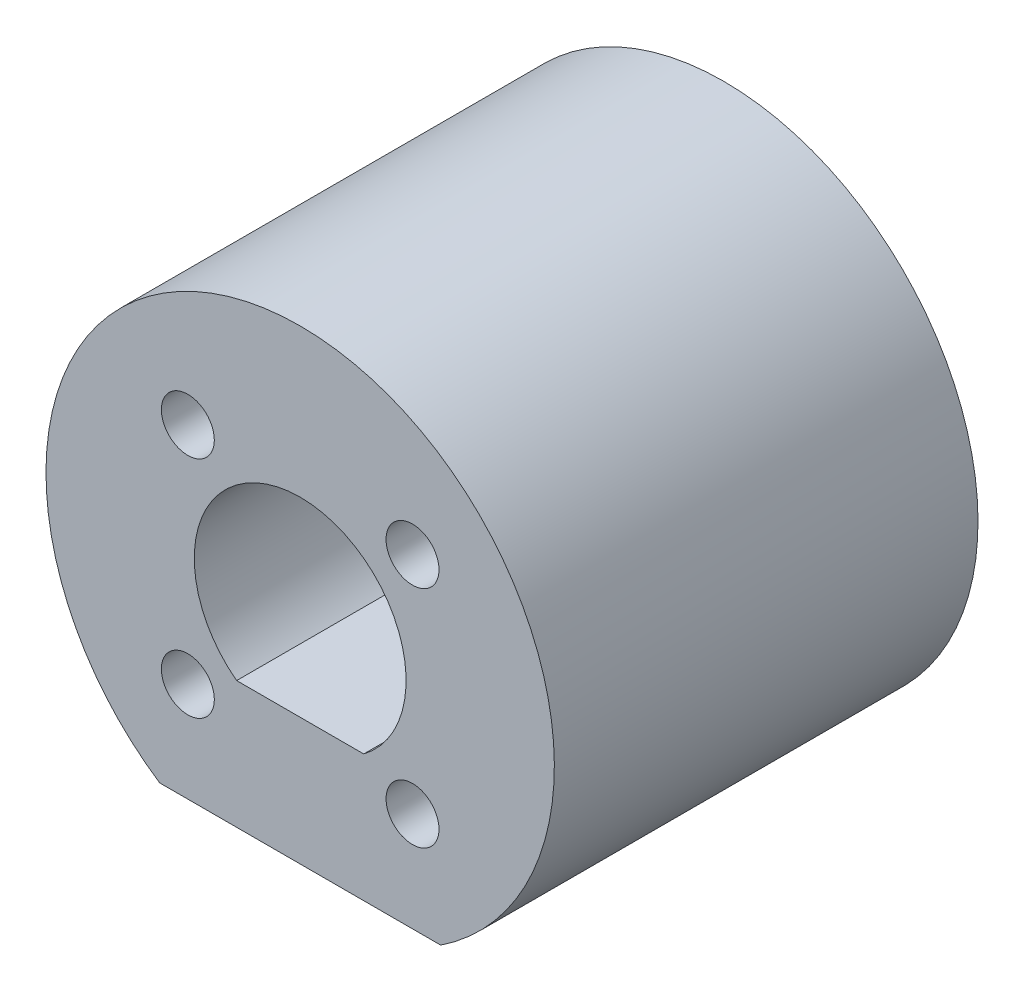
ISO-10303-21;
HEADER;
FILE_DESCRIPTION(('STEP AP214'),'2;1');
FILE_NAME('part.step','',(''),(''),'','','');
FILE_SCHEMA(('AUTOMOTIVE_DESIGN { 1 0 10303 214 1 1 1 1 }'));
ENDSEC;
DATA;
#1=APPLICATION_CONTEXT('core data for automotive mechanical design processes');
#2=APPLICATION_PROTOCOL_DEFINITION('international standard','automotive_design',2000,#1);
#3=PRODUCT_CONTEXT('',#1,'mechanical');
#4=PRODUCT('Part','Part','',(#3));
#5=PRODUCT_RELATED_PRODUCT_CATEGORY('part','',(#4));
#6=PRODUCT_DEFINITION_FORMATION('','',#4);
#7=PRODUCT_DEFINITION_CONTEXT('part definition',#1,'design');
#8=PRODUCT_DEFINITION('design','',#6,#7);
#9=PRODUCT_DEFINITION_SHAPE('','',#8);
#10=(LENGTH_UNIT() NAMED_UNIT(*) SI_UNIT(.MILLI.,.METRE.));
#11=(NAMED_UNIT(*) PLANE_ANGLE_UNIT() SI_UNIT($,.RADIAN.));
#12=(NAMED_UNIT(*) SI_UNIT($,.STERADIAN.) SOLID_ANGLE_UNIT());
#13=UNCERTAINTY_MEASURE_WITH_UNIT(LENGTH_MEASURE(1.E-05),#10,'distance_accuracy_value','');
#14=(GEOMETRIC_REPRESENTATION_CONTEXT(3) GLOBAL_UNCERTAINTY_ASSIGNED_CONTEXT((#13)) GLOBAL_UNIT_ASSIGNED_CONTEXT((#10,
#11,#12)) REPRESENTATION_CONTEXT('',''));
#15=CARTESIAN_POINT('',(0.,0.,0.));
#16=DIRECTION('',(0.,0.,1.));
#17=DIRECTION('',(1.,0.,0.));
#18=AXIS2_PLACEMENT_3D('',#15,#16,#17);
#19=CARTESIAN_POINT('',(-5.30330085889925,5.30330085889925,12.4999999999886));
#20=DIRECTION('',(0.,0.,1.));
#21=DIRECTION('',(1.,0.,0.));
#22=AXIS2_PLACEMENT_3D('',#19,#20,#21);
#23=CONICAL_SURFACE('',#22,1.25000000004245,1.02974425849204);
#24=CARTESIAN_POINT('',(-5.30330085905462,5.30330085889925,11.7489242261115));
#25=VERTEX_POINT('',#24);
#26=VERTEX_LOOP('',#25);
#27=FACE_BOUND('',#26,.T.);
#28=CARTESIAN_POINT('',(-5.30330085889925,5.30330085889925,12.5));
#29=DIRECTION('',(0.,0.,1.));
#30=DIRECTION('',(1.,0.,0.));
#31=AXIS2_PLACEMENT_3D('',#28,#29,#30);
#32=CIRCLE('',#31,1.24999999999999);
#33=CARTESIAN_POINT('',(-4.05330085889927,5.30330085889925,12.5));
#34=VERTEX_POINT('',#33);
#35=EDGE_CURVE('E76',#34,#34,#32,.T.);
#36=ORIENTED_EDGE('',*,*,#35,.T.);
#37=EDGE_LOOP('',(#36));
#38=FACE_BOUND('',#37,.T.);
#39=ADVANCED_FACE('F17',(#27,#38),#23,.F.);
#40=CARTESIAN_POINT('',(5.30330085889925,5.30330085889925,12.4999999998749));
#41=DIRECTION('',(0.,0.,1.));
#42=DIRECTION('',(1.,0.,0.));
#43=AXIS2_PLACEMENT_3D('',#40,#41,#42);
#44=CONICAL_SURFACE('',#43,1.24999999984159,1.02974425857084);
#45=CARTESIAN_POINT('',(5.3033008587704,5.30330085889925,11.7489242261399));
#46=VERTEX_POINT('',#45);
#47=VERTEX_LOOP('',#46);
#48=FACE_BOUND('',#47,.T.);
#49=CARTESIAN_POINT('',(5.30330085889925,5.30330085889925,12.5));
#50=DIRECTION('',(0.,0.,1.));
#51=DIRECTION('',(1.,0.,0.));
#52=AXIS2_PLACEMENT_3D('',#49,#50,#51);
#53=CIRCLE('',#52,1.24999999999999);
#54=CARTESIAN_POINT('',(6.55330085889924,5.30330085889925,12.5));
#55=VERTEX_POINT('',#54);
#56=EDGE_CURVE('E78',#55,#55,#53,.T.);
#57=ORIENTED_EDGE('',*,*,#56,.T.);
#58=EDGE_LOOP('',(#57));
#59=FACE_BOUND('',#58,.T.);
#60=ADVANCED_FACE('F73',(#48,#59),#44,.F.);
#61=CARTESIAN_POINT('',(5.30330085889925,-5.30330085889925,12.4999999999886));
#62=DIRECTION('',(0.,0.,1.));
#63=DIRECTION('',(1.,0.,0.));
#64=AXIS2_PLACEMENT_3D('',#61,#62,#63);
#65=CONICAL_SURFACE('',#64,1.25000000006896,1.02974425868194);
#66=CARTESIAN_POINT('',(5.30330085891251,-5.30330085889925,11.7489242261968));
#67=VERTEX_POINT('',#66);
#68=VERTEX_LOOP('',#67);
#69=FACE_BOUND('',#68,.T.);
#70=CARTESIAN_POINT('',(5.30330085889925,-5.30330085889925,12.5));
#71=DIRECTION('',(0.,0.,1.));
#72=DIRECTION('',(1.,0.,0.));
#73=AXIS2_PLACEMENT_3D('',#70,#71,#72);
#74=CIRCLE('',#73,1.24999999999999);
#75=CARTESIAN_POINT('',(6.55330085889924,-5.30330085889925,12.5));
#76=VERTEX_POINT('',#75);
#77=EDGE_CURVE('E81',#76,#76,#74,.T.);
#78=ORIENTED_EDGE('',*,*,#77,.T.);
#79=EDGE_LOOP('',(#78));
#80=FACE_BOUND('',#79,.T.);
#81=ADVANCED_FACE('F209',(#69,#80),#65,.F.);
#82=CARTESIAN_POINT('',(-5.30330085889925,-5.30330085889925,12.4999999999886));
#83=DIRECTION('',(0.,0.,1.));
#84=DIRECTION('',(1.,0.,0.));
#85=AXIS2_PLACEMENT_3D('',#82,#83,#84);
#86=CONICAL_SURFACE('',#85,1.24999999998561,1.0297442586525);
#87=CARTESIAN_POINT('',(-5.30330085896935,-5.30330085889925,11.7489242262252));
#88=VERTEX_POINT('',#87);
#89=VERTEX_LOOP('',#88);
#90=FACE_BOUND('',#89,.T.);
#91=CARTESIAN_POINT('',(-5.30330085889925,-5.30330085889925,12.5));
#92=DIRECTION('',(0.,0.,1.));
#93=DIRECTION('',(1.,0.,0.));
#94=AXIS2_PLACEMENT_3D('',#91,#92,#93);
#95=CIRCLE('',#94,1.24999999999999);
#96=CARTESIAN_POINT('',(-4.05330085889927,-5.30330085889925,12.5));
#97=VERTEX_POINT('',#96);
#98=EDGE_CURVE('E121',#97,#97,#95,.T.);
#99=ORIENTED_EDGE('',*,*,#98,.T.);
#100=EDGE_LOOP('',(#99));
#101=FACE_BOUND('',#100,.T.);
#102=ADVANCED_FACE('F205',(#90,#101),#86,.F.);
#103=CARTESIAN_POINT('',(0.,-4.,4.));
#104=DIRECTION('',(0.,1.,0.));
#105=DIRECTION('',(0.,0.,1.));
#106=AXIS2_PLACEMENT_3D('',#103,#104,#105);
#107=CYLINDRICAL_SURFACE('',#106,1.24999999999999);
#108=CARTESIAN_POINT('',(0.,-4.,4.));
#109=DIRECTION('',(0.,1.,0.));
#110=DIRECTION('',(0.,0.,1.));
#111=AXIS2_PLACEMENT_3D('',#108,#109,#110);
#112=CIRCLE('',#111,1.24999999999999);
#113=CARTESIAN_POINT('',(0.,-4.,5.24999999999999));
#114=VERTEX_POINT('',#113);
#115=EDGE_CURVE('E20',#114,#114,#112,.F.);
#116=ORIENTED_EDGE('',*,*,#115,.F.);
#117=EDGE_LOOP('',(#116));
#118=FACE_BOUND('',#117,.T.);
#119=CARTESIAN_POINT('',(0.,-10.,4.));
#120=DIRECTION('',(0.,1.,0.));
#121=DIRECTION('',(0.,0.,1.));
#122=AXIS2_PLACEMENT_3D('',#119,#120,#121);
#123=CIRCLE('',#122,1.24999999999999);
#124=CARTESIAN_POINT('',(0.,-10.,5.24999999999999));
#125=VERTEX_POINT('',#124);
#126=EDGE_CURVE('E111',#125,#125,#123,.F.);
#127=ORIENTED_EDGE('',*,*,#126,.T.);
#128=EDGE_LOOP('',(#127));
#129=FACE_BOUND('',#128,.T.);
#130=ADVANCED_FACE('F201',(#118,#129),#107,.F.);
#131=CARTESIAN_POINT('',(0.,-4.,10.));
#132=DIRECTION('',(0.,1.,0.));
#133=DIRECTION('',(0.,0.,1.));
#134=AXIS2_PLACEMENT_3D('',#131,#132,#133);
#135=CYLINDRICAL_SURFACE('',#134,1.5);
#136=CARTESIAN_POINT('',(0.,-4.,10.));
#137=DIRECTION('',(0.,1.,0.));
#138=DIRECTION('',(0.,0.,1.));
#139=AXIS2_PLACEMENT_3D('',#136,#137,#138);
#140=CIRCLE('',#139,1.5);
#141=CARTESIAN_POINT('',(0.,-4.,11.5));
#142=VERTEX_POINT('',#141);
#143=EDGE_CURVE('E114',#142,#142,#140,.F.);
#144=ORIENTED_EDGE('',*,*,#143,.F.);
#145=EDGE_LOOP('',(#144));
#146=FACE_BOUND('',#145,.T.);
#147=CARTESIAN_POINT('',(0.,-10.,10.));
#148=DIRECTION('',(0.,1.,0.));
#149=DIRECTION('',(0.,0.,1.));
#150=AXIS2_PLACEMENT_3D('',#147,#148,#149);
#151=CIRCLE('',#150,1.5);
#152=CARTESIAN_POINT('',(0.,-10.,11.5));
#153=VERTEX_POINT('',#152);
#154=EDGE_CURVE('E108',#153,#153,#151,.F.);
#155=ORIENTED_EDGE('',*,*,#154,.T.);
#156=EDGE_LOOP('',(#155));
#157=FACE_BOUND('',#156,.T.);
#158=ADVANCED_FACE('F197',(#146,#157),#135,.F.);
#159=CARTESIAN_POINT('',(-5.30330085889925,5.30330085889925,20.));
#160=DIRECTION('',(0.,0.,1.));
#161=DIRECTION('',(1.,0.,0.));
#162=AXIS2_PLACEMENT_3D('',#159,#160,#161);
#163=CYLINDRICAL_SURFACE('',#162,1.24999999999999);
#164=CARTESIAN_POINT('',(-5.30330085889925,5.30330085889925,20.));
#165=DIRECTION('',(0.,0.,1.));
#166=DIRECTION('',(1.,0.,0.));
#167=AXIS2_PLACEMENT_3D('',#164,#165,#166);
#168=CIRCLE('',#167,1.24999999999999);
#169=CARTESIAN_POINT('',(-4.05330085889927,5.30330085889925,20.));
#170=VERTEX_POINT('',#169);
#171=EDGE_CURVE('E104',#170,#170,#168,.F.);
#172=ORIENTED_EDGE('',*,*,#171,.F.);
#173=EDGE_LOOP('',(#172));
#174=FACE_BOUND('',#173,.T.);
#175=ORIENTED_EDGE('',*,*,#35,.F.);
#176=EDGE_LOOP('',(#175));
#177=FACE_BOUND('',#176,.T.);
#178=ADVANCED_FACE('F193',(#174,#177),#163,.F.);
#179=CARTESIAN_POINT('',(5.30330085889925,5.30330085889925,20.));
#180=DIRECTION('',(0.,0.,1.));
#181=DIRECTION('',(1.,0.,0.));
#182=AXIS2_PLACEMENT_3D('',#179,#180,#181);
#183=CYLINDRICAL_SURFACE('',#182,1.24999999999999);
#184=CARTESIAN_POINT('',(5.30330085889925,5.30330085889925,20.));
#185=DIRECTION('',(0.,0.,1.));
#186=DIRECTION('',(1.,0.,0.));
#187=AXIS2_PLACEMENT_3D('',#184,#185,#186);
#188=CIRCLE('',#187,1.24999999999999);
#189=CARTESIAN_POINT('',(6.55330085889924,5.30330085889925,20.));
#190=VERTEX_POINT('',#189);
#191=EDGE_CURVE('E101',#190,#190,#188,.F.);
#192=ORIENTED_EDGE('',*,*,#191,.F.);
#193=EDGE_LOOP('',(#192));
#194=FACE_BOUND('',#193,.T.);
#195=ORIENTED_EDGE('',*,*,#56,.F.);
#196=EDGE_LOOP('',(#195));
#197=FACE_BOUND('',#196,.T.);
#198=ADVANCED_FACE('F189',(#194,#197),#183,.F.);
#199=CARTESIAN_POINT('',(5.30330085889925,-5.30330085889925,20.));
#200=DIRECTION('',(0.,0.,1.));
#201=DIRECTION('',(1.,0.,0.));
#202=AXIS2_PLACEMENT_3D('',#199,#200,#201);
#203=CYLINDRICAL_SURFACE('',#202,1.24999999999999);
#204=CARTESIAN_POINT('',(5.30330085889925,-5.30330085889925,20.));
#205=DIRECTION('',(0.,0.,1.));
#206=DIRECTION('',(1.,0.,0.));
#207=AXIS2_PLACEMENT_3D('',#204,#205,#206);
#208=CIRCLE('',#207,1.24999999999999);
#209=CARTESIAN_POINT('',(6.55330085889924,-5.30330085889925,20.));
#210=VERTEX_POINT('',#209);
#211=EDGE_CURVE('E98',#210,#210,#208,.F.);
#212=ORIENTED_EDGE('',*,*,#211,.F.);
#213=EDGE_LOOP('',(#212));
#214=FACE_BOUND('',#213,.T.);
#215=ORIENTED_EDGE('',*,*,#77,.F.);
#216=EDGE_LOOP('',(#215));
#217=FACE_BOUND('',#216,.T.);
#218=ADVANCED_FACE('F185',(#214,#217),#203,.F.);
#219=CARTESIAN_POINT('',(-5.30330085889925,-5.30330085889925,20.));
#220=DIRECTION('',(0.,0.,1.));
#221=DIRECTION('',(1.,0.,0.));
#222=AXIS2_PLACEMENT_3D('',#219,#220,#221);
#223=CYLINDRICAL_SURFACE('',#222,1.24999999999999);
#224=CARTESIAN_POINT('',(-5.30330085889925,-5.30330085889925,20.));
#225=DIRECTION('',(0.,0.,1.));
#226=DIRECTION('',(1.,0.,0.));
#227=AXIS2_PLACEMENT_3D('',#224,#225,#226);
#228=CIRCLE('',#227,1.24999999999999);
#229=CARTESIAN_POINT('',(-4.05330085889927,-5.30330085889925,20.));
#230=VERTEX_POINT('',#229);
#231=EDGE_CURVE('E95',#230,#230,#228,.F.);
#232=ORIENTED_EDGE('',*,*,#231,.F.);
#233=EDGE_LOOP('',(#232));
#234=FACE_BOUND('',#233,.T.);
#235=ORIENTED_EDGE('',*,*,#98,.F.);
#236=EDGE_LOOP('',(#235));
#237=FACE_BOUND('',#236,.T.);
#238=ADVANCED_FACE('F182',(#234,#237),#223,.F.);
#239=CARTESIAN_POINT('',(0.,-4.,20.));
#240=DIRECTION('',(0.,1.,0.));
#241=DIRECTION('',(0.,0.,1.));
#242=AXIS2_PLACEMENT_3D('',#239,#240,#241);
#243=PLANE('',#242);
#244=DIRECTION('',(1.,0.,0.));
#245=VECTOR('',#244,1.);
#246=CARTESIAN_POINT('',(0.,-4.,20.));
#247=LINE('',#246,#245);
#248=CARTESIAN_POINT('',(3.,-4.,20.));
#249=VERTEX_POINT('',#248);
#250=CARTESIAN_POINT('',(-3.,-4.,20.));
#251=VERTEX_POINT('',#250);
#252=EDGE_CURVE('E57',#249,#251,#247,.F.);
#253=ORIENTED_EDGE('',*,*,#252,.F.);
#254=DIRECTION('',(0.,0.,-1.));
#255=VECTOR('',#254,1.);
#256=CARTESIAN_POINT('',(3.,-4.,20.));
#257=LINE('',#256,#255);
#258=CARTESIAN_POINT('',(3.,-4.,0.));
#259=VERTEX_POINT('',#258);
#260=EDGE_CURVE('E113',#249,#259,#257,.T.);
#261=ORIENTED_EDGE('',*,*,#260,.T.);
#262=DIRECTION('',(1.,0.,0.));
#263=VECTOR('',#262,1.);
#264=CARTESIAN_POINT('',(0.,-4.,0.));
#265=LINE('',#264,#263);
#266=CARTESIAN_POINT('',(-3.,-4.,0.));
#267=VERTEX_POINT('',#266);
#268=EDGE_CURVE('E90',#259,#267,#265,.F.);
#269=ORIENTED_EDGE('',*,*,#268,.T.);
#270=DIRECTION('',(0.,0.,-1.));
#271=VECTOR('',#270,1.);
#272=CARTESIAN_POINT('',(-3.,-4.,20.));
#273=LINE('',#272,#271);
#274=EDGE_CURVE('E116',#267,#251,#273,.F.);
#275=ORIENTED_EDGE('',*,*,#274,.T.);
#276=EDGE_LOOP('',(#253,#261,#269,#275));
#277=FACE_BOUND('',#276,.T.);
#278=ORIENTED_EDGE('',*,*,#143,.T.);
#279=EDGE_LOOP('',(#278));
#280=FACE_BOUND('',#279,.T.);
#281=ORIENTED_EDGE('',*,*,#115,.T.);
#282=EDGE_LOOP('',(#281));
#283=FACE_BOUND('',#282,.T.);
#284=ADVANCED_FACE('F142',(#277,#280,#283),#243,.T.);
#285=CARTESIAN_POINT('',(0.,0.,20.));
#286=DIRECTION('',(0.,0.,-1.));
#287=DIRECTION('',(-1.,0.,0.));
#288=AXIS2_PLACEMENT_3D('',#285,#286,#287);
#289=CYLINDRICAL_SURFACE('',#288,5.);
#290=CARTESIAN_POINT('',(0.,0.,20.));
#291=DIRECTION('',(0.,0.,-1.));
#292=DIRECTION('',(-1.,0.,0.));
#293=AXIS2_PLACEMENT_3D('',#290,#291,#292);
#294=CIRCLE('',#293,5.);
#295=EDGE_CURVE('E91',#251,#249,#294,.T.);
#296=ORIENTED_EDGE('',*,*,#295,.F.);
#297=ORIENTED_EDGE('',*,*,#274,.F.);
#298=CARTESIAN_POINT('',(0.,0.,0.));
#299=DIRECTION('',(0.,0.,-1.));
#300=DIRECTION('',(-1.,0.,0.));
#301=AXIS2_PLACEMENT_3D('',#298,#299,#300);
#302=CIRCLE('',#301,5.);
#303=EDGE_CURVE('E87',#267,#259,#302,.T.);
#304=ORIENTED_EDGE('',*,*,#303,.T.);
#305=ORIENTED_EDGE('',*,*,#260,.F.);
#306=EDGE_LOOP('',(#296,#297,#304,#305));
#307=FACE_BOUND('',#306,.T.);
#308=ADVANCED_FACE('F145',(#307),#289,.F.);
#309=CARTESIAN_POINT('',(0.,-10.,20.));
#310=DIRECTION('',(0.,1.,0.));
#311=DIRECTION('',(-1.,0.,0.));
#312=AXIS2_PLACEMENT_3D('',#309,#310,#311);
#313=PLANE('',#312);
#314=ORIENTED_EDGE('',*,*,#154,.F.);
#315=EDGE_LOOP('',(#314));
#316=FACE_BOUND('',#315,.T.);
#317=DIRECTION('',(0.,0.,-1.));
#318=VECTOR('',#317,1.);
#319=CARTESIAN_POINT('',(6.6332495807108,-10.,20.));
#320=LINE('',#319,#318);
#321=CARTESIAN_POINT('',(6.6332495807108,-10.,20.));
#322=VERTEX_POINT('',#321);
#323=CARTESIAN_POINT('',(6.6332495807108,-10.,0.));
#324=VERTEX_POINT('',#323);
#325=EDGE_CURVE('E94',#322,#324,#320,.T.);
#326=ORIENTED_EDGE('',*,*,#325,.F.);
#327=DIRECTION('',(1.,0.,0.));
#328=VECTOR('',#327,1.);
#329=CARTESIAN_POINT('',(0.,-10.,20.));
#330=LINE('',#329,#328);
#331=CARTESIAN_POINT('',(-6.6332495807108,-10.,20.));
#332=VERTEX_POINT('',#331);
#333=EDGE_CURVE('E107',#332,#322,#330,.T.);
#334=ORIENTED_EDGE('',*,*,#333,.F.);
#335=DIRECTION('',(0.,0.,-1.));
#336=VECTOR('',#335,1.);
#337=CARTESIAN_POINT('',(-6.6332495807108,-10.,20.));
#338=LINE('',#337,#336);
#339=CARTESIAN_POINT('',(-6.6332495807108,-10.,0.));
#340=VERTEX_POINT('',#339);
#341=EDGE_CURVE('E86',#340,#332,#338,.F.);
#342=ORIENTED_EDGE('',*,*,#341,.F.);
#343=DIRECTION('',(1.,0.,0.));
#344=VECTOR('',#343,1.);
#345=CARTESIAN_POINT('',(0.,-10.,0.));
#346=LINE('',#345,#344);
#347=EDGE_CURVE('E130',#340,#324,#346,.T.);
#348=ORIENTED_EDGE('',*,*,#347,.T.);
#349=EDGE_LOOP('',(#326,#334,#342,#348));
#350=FACE_BOUND('',#349,.T.);
#351=ORIENTED_EDGE('',*,*,#126,.F.);
#352=EDGE_LOOP('',(#351));
#353=FACE_BOUND('',#352,.T.);
#354=ADVANCED_FACE('F151',(#316,#350,#353),#313,.F.);
#355=CARTESIAN_POINT('',(0.,0.,20.));
#356=DIRECTION('',(0.,0.,1.));
#357=DIRECTION('',(1.,0.,0.));
#358=AXIS2_PLACEMENT_3D('',#355,#356,#357);
#359=PLANE('',#358);
#360=ORIENTED_EDGE('',*,*,#252,.T.);
#361=ORIENTED_EDGE('',*,*,#295,.T.);
#362=EDGE_LOOP('',(#360,#361));
#363=FACE_BOUND('',#362,.T.);
#364=ORIENTED_EDGE('',*,*,#231,.T.);
#365=EDGE_LOOP('',(#364));
#366=FACE_BOUND('',#365,.T.);
#367=ORIENTED_EDGE('',*,*,#211,.T.);
#368=EDGE_LOOP('',(#367));
#369=FACE_BOUND('',#368,.T.);
#370=ORIENTED_EDGE('',*,*,#191,.T.);
#371=EDGE_LOOP('',(#370));
#372=FACE_BOUND('',#371,.T.);
#373=ORIENTED_EDGE('',*,*,#171,.T.);
#374=EDGE_LOOP('',(#373));
#375=FACE_BOUND('',#374,.T.);
#376=CARTESIAN_POINT('',(0.,0.,20.));
#377=DIRECTION('',(0.,0.,-1.));
#378=DIRECTION('',(-1.,0.,0.));
#379=AXIS2_PLACEMENT_3D('',#376,#377,#378);
#380=CIRCLE('',#379,12.);
#381=EDGE_CURVE('E26',#332,#322,#380,.T.);
#382=ORIENTED_EDGE('',*,*,#381,.F.);
#383=ORIENTED_EDGE('',*,*,#333,.T.);
#384=EDGE_LOOP('',(#382,#383));
#385=FACE_BOUND('',#384,.T.);
#386=ADVANCED_FACE('F147',(#363,#366,#369,#372,#375,#385),#359,.T.);
#387=CARTESIAN_POINT('',(0.,0.,0.));
#388=DIRECTION('',(0.,0.,1.));
#389=DIRECTION('',(1.,0.,0.));
#390=AXIS2_PLACEMENT_3D('',#387,#388,#389);
#391=PLANE('',#390);
#392=ORIENTED_EDGE('',*,*,#303,.F.);
#393=ORIENTED_EDGE('',*,*,#268,.F.);
#394=EDGE_LOOP('',(#392,#393));
#395=FACE_BOUND('',#394,.T.);
#396=ORIENTED_EDGE('',*,*,#347,.F.);
#397=CARTESIAN_POINT('',(0.,0.,0.));
#398=DIRECTION('',(0.,0.,-1.));
#399=DIRECTION('',(-1.,0.,0.));
#400=AXIS2_PLACEMENT_3D('',#397,#398,#399);
#401=CIRCLE('',#400,12.);
#402=EDGE_CURVE('E11',#324,#340,#401,.F.);
#403=ORIENTED_EDGE('',*,*,#402,.F.);
#404=EDGE_LOOP('',(#396,#403));
#405=FACE_BOUND('',#404,.T.);
#406=ADVANCED_FACE('F150',(#395,#405),#391,.F.);
#407=CARTESIAN_POINT('',(0.,0.,20.));
#408=DIRECTION('',(0.,0.,-1.));
#409=DIRECTION('',(-1.,0.,0.));
#410=AXIS2_PLACEMENT_3D('',#407,#408,#409);
#411=CYLINDRICAL_SURFACE('',#410,12.);
#412=ORIENTED_EDGE('',*,*,#402,.T.);
#413=ORIENTED_EDGE('',*,*,#341,.T.);
#414=ORIENTED_EDGE('',*,*,#381,.T.);
#415=ORIENTED_EDGE('',*,*,#325,.T.);
#416=EDGE_LOOP('',(#412,#413,#414,#415));
#417=FACE_BOUND('',#416,.T.);
#418=ADVANCED_FACE('F166',(#417),#411,.T.);
#419=CLOSED_SHELL('',(#39,#60,#81,#102,#130,#158,#178,#198,#218,#238,#284,#308,#354,#386,#406,#418));
#420=MANIFOLD_SOLID_BREP('B1',#419);
#421=ADVANCED_BREP_SHAPE_REPRESENTATION('',(#18,#420),#14);
#422=SHAPE_DEFINITION_REPRESENTATION(#9,#421);
ENDSEC;
END-ISO-10303-21;
